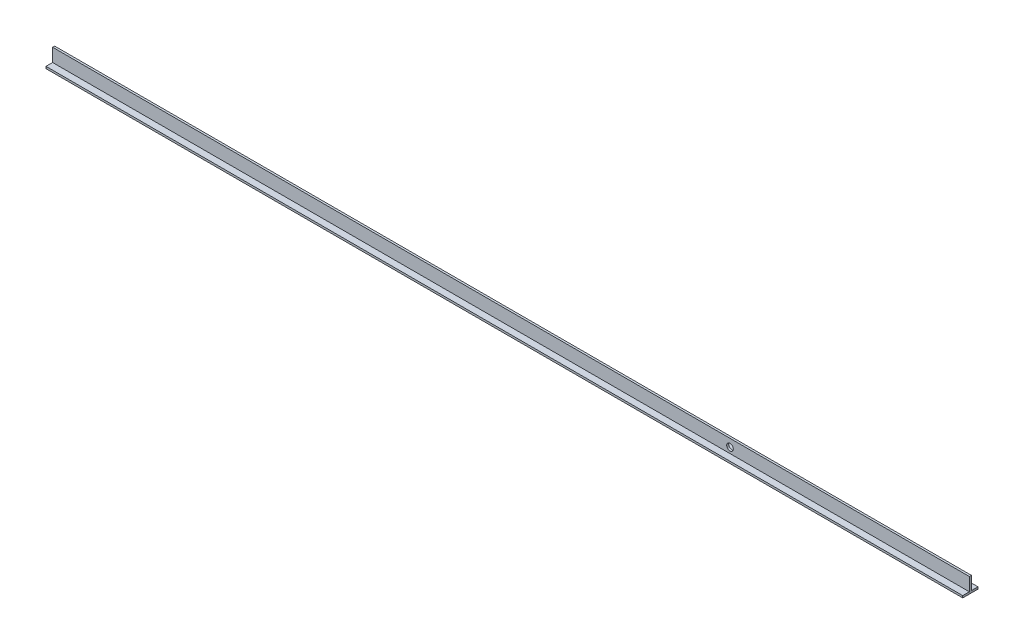
ISO-10303-21;
HEADER;
FILE_DESCRIPTION(('STEP AP214'),'2;1');
FILE_NAME('part.step','',(''),(''),'','','');
FILE_SCHEMA(('AUTOMOTIVE_DESIGN { 1 0 10303 214 1 1 1 1 }'));
ENDSEC;
DATA;
#1=APPLICATION_CONTEXT('core data for automotive mechanical design processes');
#2=APPLICATION_PROTOCOL_DEFINITION('international standard','automotive_design',2000,#1);
#3=PRODUCT_CONTEXT('',#1,'mechanical');
#4=PRODUCT('Part','Part','',(#3));
#5=PRODUCT_RELATED_PRODUCT_CATEGORY('part','',(#4));
#6=PRODUCT_DEFINITION_FORMATION('','',#4);
#7=PRODUCT_DEFINITION_CONTEXT('part definition',#1,'design');
#8=PRODUCT_DEFINITION('design','',#6,#7);
#9=PRODUCT_DEFINITION_SHAPE('','',#8);
#10=(LENGTH_UNIT() NAMED_UNIT(*) SI_UNIT(.MILLI.,.METRE.));
#11=(NAMED_UNIT(*) PLANE_ANGLE_UNIT() SI_UNIT($,.RADIAN.));
#12=(NAMED_UNIT(*) SI_UNIT($,.STERADIAN.) SOLID_ANGLE_UNIT());
#13=UNCERTAINTY_MEASURE_WITH_UNIT(LENGTH_MEASURE(1.E-05),#10,'distance_accuracy_value','');
#14=(GEOMETRIC_REPRESENTATION_CONTEXT(3) GLOBAL_UNCERTAINTY_ASSIGNED_CONTEXT((#13)) GLOBAL_UNIT_ASSIGNED_CONTEXT((#10,
#11,#12)) REPRESENTATION_CONTEXT('',''));
#15=CARTESIAN_POINT('',(0.,0.,0.));
#16=DIRECTION('',(0.,0.,1.));
#17=DIRECTION('',(1.,0.,0.));
#18=AXIS2_PLACEMENT_3D('',#15,#16,#17);
#19=CARTESIAN_POINT('',(-900.,3.99999999999984,15.));
#20=DIRECTION('',(0.,0.,-1.));
#21=DIRECTION('',(0.,1.,0.));
#22=AXIS2_PLACEMENT_3D('',#19,#20,#21);
#23=PLANE('',#22);
#24=DIRECTION('',(0.,1.,0.));
#25=VECTOR('',#24,1.);
#26=CARTESIAN_POINT('',(900.,4.00000000000039,15.));
#27=LINE('',#26,#25);
#28=CARTESIAN_POINT('',(900.,3.91599383446464E-13,15.));
#29=VERTEX_POINT('',#28);
#30=CARTESIAN_POINT('',(900.,4.00000000000039,15.));
#31=VERTEX_POINT('',#30);
#32=EDGE_CURVE('E163',#29,#31,#27,.T.);
#33=ORIENTED_EDGE('',*,*,#32,.T.);
#34=DIRECTION('',(1.,0.,0.));
#35=VECTOR('',#34,1.);
#36=CARTESIAN_POINT('',(-900.,3.99999999999984,15.));
#37=LINE('',#36,#35);
#38=CARTESIAN_POINT('',(-900.,3.99999999999984,15.));
#39=VERTEX_POINT('',#38);
#40=EDGE_CURVE('E13',#39,#31,#37,.T.);
#41=ORIENTED_EDGE('',*,*,#40,.F.);
#42=DIRECTION('',(0.,1.,0.));
#43=VECTOR('',#42,1.);
#44=CARTESIAN_POINT('',(-900.,3.99999999999984,15.));
#45=LINE('',#44,#43);
#46=CARTESIAN_POINT('',(-900.,-1.59491676169845E-13,15.));
#47=VERTEX_POINT('',#46);
#48=EDGE_CURVE('E178',#47,#39,#45,.T.);
#49=ORIENTED_EDGE('',*,*,#48,.F.);
#50=DIRECTION('',(1.,0.,0.));
#51=VECTOR('',#50,1.);
#52=CARTESIAN_POINT('',(-900.,-1.59491676169845E-13,15.));
#53=LINE('',#52,#51);
#54=EDGE_CURVE('E159',#47,#29,#53,.T.);
#55=ORIENTED_EDGE('',*,*,#54,.T.);
#56=EDGE_LOOP('',(#33,#41,#49,#55));
#57=FACE_BOUND('',#56,.T.);
#58=ADVANCED_FACE('F66',(#57),#23,.F.);
#59=CARTESIAN_POINT('',(-900.,3.99999999999979,1.99999999999999));
#60=DIRECTION('',(0.,-1.,0.));
#61=DIRECTION('',(0.,0.,-1.));
#62=AXIS2_PLACEMENT_3D('',#59,#60,#61);
#63=PLANE('',#62);
#64=DIRECTION('',(0.,0.,-1.));
#65=VECTOR('',#64,1.);
#66=CARTESIAN_POINT('',(900.,4.00000000000034,1.99999999999999));
#67=LINE('',#66,#65);
#68=CARTESIAN_POINT('',(900.,4.00000000000034,1.99999999999999));
#69=VERTEX_POINT('',#68);
#70=EDGE_CURVE('E166',#31,#69,#67,.T.);
#71=ORIENTED_EDGE('',*,*,#70,.T.);
#72=DIRECTION('',(1.,0.,0.));
#73=VECTOR('',#72,1.);
#74=CARTESIAN_POINT('',(-900.,3.99999999999979,1.99999999999999));
#75=LINE('',#74,#73);
#76=CARTESIAN_POINT('',(-900.,3.99999999999979,1.99999999999999));
#77=VERTEX_POINT('',#76);
#78=EDGE_CURVE('E75',#77,#69,#75,.T.);
#79=ORIENTED_EDGE('',*,*,#78,.F.);
#80=DIRECTION('',(0.,0.,-1.));
#81=VECTOR('',#80,1.);
#82=CARTESIAN_POINT('',(-900.,3.99999999999979,1.99999999999999));
#83=LINE('',#82,#81);
#84=EDGE_CURVE('E126',#39,#77,#83,.T.);
#85=ORIENTED_EDGE('',*,*,#84,.F.);
#86=ORIENTED_EDGE('',*,*,#40,.T.);
#87=EDGE_LOOP('',(#71,#79,#85,#86));
#88=FACE_BOUND('',#87,.T.);
#89=ADVANCED_FACE('F229',(#88),#63,.F.);
#90=CARTESIAN_POINT('',(-900.,29.9999999999998,1.99999999999989));
#91=DIRECTION('',(0.,0.,-1.));
#92=DIRECTION('',(0.,1.,0.));
#93=AXIS2_PLACEMENT_3D('',#90,#91,#92);
#94=PLANE('',#93);
#95=CARTESIAN_POINT('',(430.,14.9999999999996,1.99999999999995));
#96=DIRECTION('',(0.,0.,-1.));
#97=DIRECTION('',(0.,1.,0.));
#98=AXIS2_PLACEMENT_3D('',#95,#96,#97);
#99=CIRCLE('',#98,6.49999999999997);
#100=CARTESIAN_POINT('',(430.,21.4999999999996,1.99999999999993));
#101=VERTEX_POINT('',#100);
#102=EDGE_CURVE('E167',#101,#101,#99,.T.);
#103=ORIENTED_EDGE('',*,*,#102,.T.);
#104=EDGE_LOOP('',(#103));
#105=FACE_BOUND('',#104,.T.);
#106=DIRECTION('',(0.,1.,0.));
#107=VECTOR('',#106,1.);
#108=CARTESIAN_POINT('',(900.,30.0000000000003,1.99999999999989));
#109=LINE('',#108,#107);
#110=CARTESIAN_POINT('',(900.,30.0000000000003,1.99999999999989));
#111=VERTEX_POINT('',#110);
#112=EDGE_CURVE('E169',#69,#111,#109,.T.);
#113=ORIENTED_EDGE('',*,*,#112,.T.);
#114=DIRECTION('',(1.,0.,0.));
#115=VECTOR('',#114,1.);
#116=CARTESIAN_POINT('',(-900.,29.9999999999998,1.99999999999989));
#117=LINE('',#116,#115);
#118=CARTESIAN_POINT('',(-900.,29.9999999999998,1.99999999999989));
#119=VERTEX_POINT('',#118);
#120=EDGE_CURVE('E185',#119,#111,#117,.T.);
#121=ORIENTED_EDGE('',*,*,#120,.F.);
#122=DIRECTION('',(0.,1.,0.));
#123=VECTOR('',#122,1.);
#124=CARTESIAN_POINT('',(-900.,29.9999999999998,1.99999999999989));
#125=LINE('',#124,#123);
#126=EDGE_CURVE('E194',#77,#119,#125,.T.);
#127=ORIENTED_EDGE('',*,*,#126,.F.);
#128=ORIENTED_EDGE('',*,*,#78,.T.);
#129=EDGE_LOOP('',(#113,#121,#127,#128));
#130=FACE_BOUND('',#129,.T.);
#131=ADVANCED_FACE('F192',(#105,#130),#94,.F.);
#132=CARTESIAN_POINT('',(-900.,29.9999999999998,-2.0000000000001));
#133=DIRECTION('',(0.,-1.,0.));
#134=DIRECTION('',(0.,0.,-1.));
#135=AXIS2_PLACEMENT_3D('',#132,#133,#134);
#136=PLANE('',#135);
#137=DIRECTION('',(0.,0.,-1.));
#138=VECTOR('',#137,1.);
#139=CARTESIAN_POINT('',(900.,30.0000000000003,-2.0000000000001));
#140=LINE('',#139,#138);
#141=CARTESIAN_POINT('',(900.,30.0000000000003,-2.0000000000001));
#142=VERTEX_POINT('',#141);
#143=EDGE_CURVE('E171',#111,#142,#140,.T.);
#144=ORIENTED_EDGE('',*,*,#143,.T.);
#145=DIRECTION('',(1.,0.,0.));
#146=VECTOR('',#145,1.);
#147=CARTESIAN_POINT('',(-900.,29.9999999999998,-2.0000000000001));
#148=LINE('',#147,#146);
#149=CARTESIAN_POINT('',(-900.,29.9999999999998,-2.0000000000001));
#150=VERTEX_POINT('',#149);
#151=EDGE_CURVE('E182',#150,#142,#148,.T.);
#152=ORIENTED_EDGE('',*,*,#151,.F.);
#153=DIRECTION('',(0.,0.,-1.));
#154=VECTOR('',#153,1.);
#155=CARTESIAN_POINT('',(-900.,29.9999999999998,-2.0000000000001));
#156=LINE('',#155,#154);
#157=EDGE_CURVE('E206',#119,#150,#156,.T.);
#158=ORIENTED_EDGE('',*,*,#157,.F.);
#159=ORIENTED_EDGE('',*,*,#120,.T.);
#160=EDGE_LOOP('',(#144,#152,#158,#159));
#161=FACE_BOUND('',#160,.T.);
#162=ADVANCED_FACE('F202',(#161),#136,.F.);
#163=CARTESIAN_POINT('',(-900.,3.99999999999978,-2.00000000000002));
#164=DIRECTION('',(0.,0.,1.));
#165=DIRECTION('',(0.,-1.,0.));
#166=AXIS2_PLACEMENT_3D('',#163,#164,#165);
#167=PLANE('',#166);
#168=CARTESIAN_POINT('',(430.,14.9999999999996,-2.00000000000005));
#169=DIRECTION('',(0.,0.,1.));
#170=DIRECTION('',(0.,-1.,0.));
#171=AXIS2_PLACEMENT_3D('',#168,#169,#170);
#172=CIRCLE('',#171,6.49999999999997);
#173=CARTESIAN_POINT('',(430.,8.49999999999963,-2.00000000000003));
#174=VERTEX_POINT('',#173);
#175=EDGE_CURVE('E69',#174,#174,#172,.T.);
#176=ORIENTED_EDGE('',*,*,#175,.T.);
#177=EDGE_LOOP('',(#176));
#178=FACE_BOUND('',#177,.T.);
#179=DIRECTION('',(0.,-1.,0.));
#180=VECTOR('',#179,1.);
#181=CARTESIAN_POINT('',(900.,4.00000000000033,-2.00000000000002));
#182=LINE('',#181,#180);
#183=CARTESIAN_POINT('',(900.,4.00000000000033,-2.00000000000002));
#184=VERTEX_POINT('',#183);
#185=EDGE_CURVE('E173',#142,#184,#182,.T.);
#186=ORIENTED_EDGE('',*,*,#185,.T.);
#187=DIRECTION('',(1.,0.,0.));
#188=VECTOR('',#187,1.);
#189=CARTESIAN_POINT('',(-900.,3.99999999999978,-2.00000000000002));
#190=LINE('',#189,#188);
#191=CARTESIAN_POINT('',(-900.,3.99999999999978,-2.00000000000002));
#192=VERTEX_POINT('',#191);
#193=EDGE_CURVE('E154',#192,#184,#190,.T.);
#194=ORIENTED_EDGE('',*,*,#193,.F.);
#195=DIRECTION('',(0.,-1.,0.));
#196=VECTOR('',#195,1.);
#197=CARTESIAN_POINT('',(-900.,3.99999999999978,-2.00000000000002));
#198=LINE('',#197,#196);
#199=EDGE_CURVE('E145',#150,#192,#198,.T.);
#200=ORIENTED_EDGE('',*,*,#199,.F.);
#201=ORIENTED_EDGE('',*,*,#151,.T.);
#202=EDGE_LOOP('',(#186,#194,#200,#201));
#203=FACE_BOUND('',#202,.T.);
#204=ADVANCED_FACE('F205',(#178,#203),#167,.F.);
#205=CARTESIAN_POINT('',(-900.,3.99999999999973,-15.));
#206=DIRECTION('',(0.,-1.,0.));
#207=DIRECTION('',(0.,0.,-1.));
#208=AXIS2_PLACEMENT_3D('',#205,#206,#207);
#209=PLANE('',#208);
#210=DIRECTION('',(0.,0.,-1.));
#211=VECTOR('',#210,1.);
#212=CARTESIAN_POINT('',(900.,4.00000000000028,-15.));
#213=LINE('',#212,#211);
#214=CARTESIAN_POINT('',(900.,4.00000000000028,-15.));
#215=VERTEX_POINT('',#214);
#216=EDGE_CURVE('E153',#184,#215,#213,.T.);
#217=ORIENTED_EDGE('',*,*,#216,.T.);
#218=DIRECTION('',(1.,0.,0.));
#219=VECTOR('',#218,1.);
#220=CARTESIAN_POINT('',(-900.,3.99999999999973,-15.));
#221=LINE('',#220,#219);
#222=CARTESIAN_POINT('',(-900.,3.99999999999973,-15.));
#223=VERTEX_POINT('',#222);
#224=EDGE_CURVE('E150',#223,#215,#221,.T.);
#225=ORIENTED_EDGE('',*,*,#224,.F.);
#226=DIRECTION('',(0.,0.,-1.));
#227=VECTOR('',#226,1.);
#228=CARTESIAN_POINT('',(-900.,3.99999999999973,-15.));
#229=LINE('',#228,#227);
#230=EDGE_CURVE('E139',#192,#223,#229,.T.);
#231=ORIENTED_EDGE('',*,*,#230,.F.);
#232=ORIENTED_EDGE('',*,*,#193,.T.);
#233=EDGE_LOOP('',(#217,#225,#231,#232));
#234=FACE_BOUND('',#233,.T.);
#235=ADVANCED_FACE('F151',(#234),#209,.F.);
#236=CARTESIAN_POINT('',(-900.,-2.69747026931302E-13,-15.));
#237=DIRECTION('',(0.,0.,1.));
#238=DIRECTION('',(0.,-1.,0.));
#239=AXIS2_PLACEMENT_3D('',#236,#237,#238);
#240=PLANE('',#239);
#241=DIRECTION('',(0.,-1.,0.));
#242=VECTOR('',#241,1.);
#243=CARTESIAN_POINT('',(900.,2.81344032685007E-13,-15.));
#244=LINE('',#243,#242);
#245=CARTESIAN_POINT('',(900.,2.81344032685007E-13,-15.));
#246=VERTEX_POINT('',#245);
#247=EDGE_CURVE('E112',#215,#246,#244,.T.);
#248=ORIENTED_EDGE('',*,*,#247,.T.);
#249=DIRECTION('',(1.,0.,0.));
#250=VECTOR('',#249,1.);
#251=CARTESIAN_POINT('',(-900.,-2.69747026931302E-13,-15.));
#252=LINE('',#251,#250);
#253=CARTESIAN_POINT('',(-900.,-2.69747026931302E-13,-15.));
#254=VERTEX_POINT('',#253);
#255=EDGE_CURVE('E155',#254,#246,#252,.T.);
#256=ORIENTED_EDGE('',*,*,#255,.F.);
#257=DIRECTION('',(0.,-1.,0.));
#258=VECTOR('',#257,1.);
#259=CARTESIAN_POINT('',(-900.,-2.69747026931302E-13,-15.));
#260=LINE('',#259,#258);
#261=EDGE_CURVE('E143',#223,#254,#260,.T.);
#262=ORIENTED_EDGE('',*,*,#261,.F.);
#263=ORIENTED_EDGE('',*,*,#224,.T.);
#264=EDGE_LOOP('',(#248,#256,#262,#263));
#265=FACE_BOUND('',#264,.T.);
#266=ADVANCED_FACE('F157',(#265),#240,.F.);
#267=CARTESIAN_POINT('',(-900.,-2.69747026931302E-13,-15.));
#268=DIRECTION('',(0.,1.,0.));
#269=DIRECTION('',(0.,0.,1.));
#270=AXIS2_PLACEMENT_3D('',#267,#268,#269);
#271=PLANE('',#270);
#272=DIRECTION('',(0.,0.,1.));
#273=VECTOR('',#272,1.);
#274=CARTESIAN_POINT('',(900.,2.81344032685007E-13,-15.));
#275=LINE('',#274,#273);
#276=EDGE_CURVE('E118',#246,#29,#275,.T.);
#277=ORIENTED_EDGE('',*,*,#276,.T.);
#278=ORIENTED_EDGE('',*,*,#54,.F.);
#279=DIRECTION('',(0.,0.,1.));
#280=VECTOR('',#279,1.);
#281=CARTESIAN_POINT('',(-900.,-2.69747026931302E-13,-15.));
#282=LINE('',#281,#280);
#283=EDGE_CURVE('E83',#254,#47,#282,.T.);
#284=ORIENTED_EDGE('',*,*,#283,.F.);
#285=ORIENTED_EDGE('',*,*,#255,.T.);
#286=EDGE_LOOP('',(#277,#278,#284,#285));
#287=FACE_BOUND('',#286,.T.);
#288=ADVANCED_FACE('F236',(#287),#271,.F.);
#289=CARTESIAN_POINT('',(-900.,-5.51091059616309E-13,0.));
#290=DIRECTION('',(-1.,0.,0.));
#291=DIRECTION('',(0.,0.,1.));
#292=AXIS2_PLACEMENT_3D('',#289,#290,#291);
#293=PLANE('',#292);
#294=ORIENTED_EDGE('',*,*,#48,.T.);
#295=ORIENTED_EDGE('',*,*,#84,.T.);
#296=ORIENTED_EDGE('',*,*,#126,.T.);
#297=ORIENTED_EDGE('',*,*,#157,.T.);
#298=ORIENTED_EDGE('',*,*,#199,.T.);
#299=ORIENTED_EDGE('',*,*,#230,.T.);
#300=ORIENTED_EDGE('',*,*,#261,.T.);
#301=ORIENTED_EDGE('',*,*,#283,.T.);
#302=EDGE_LOOP('',(#294,#295,#296,#297,#298,#299,#300,#301));
#303=FACE_BOUND('',#302,.T.);
#304=ADVANCED_FACE('F141',(#303),#293,.T.);
#305=CARTESIAN_POINT('',(900.,0.,0.));
#306=DIRECTION('',(-1.,0.,0.));
#307=DIRECTION('',(0.,0.,1.));
#308=AXIS2_PLACEMENT_3D('',#305,#306,#307);
#309=PLANE('',#308);
#310=ORIENTED_EDGE('',*,*,#32,.F.);
#311=ORIENTED_EDGE('',*,*,#276,.F.);
#312=ORIENTED_EDGE('',*,*,#247,.F.);
#313=ORIENTED_EDGE('',*,*,#216,.F.);
#314=ORIENTED_EDGE('',*,*,#185,.F.);
#315=ORIENTED_EDGE('',*,*,#143,.F.);
#316=ORIENTED_EDGE('',*,*,#112,.F.);
#317=ORIENTED_EDGE('',*,*,#70,.F.);
#318=EDGE_LOOP('',(#310,#311,#312,#313,#314,#315,#316,#317));
#319=FACE_BOUND('',#318,.T.);
#320=ADVANCED_FACE('F198',(#319),#309,.F.);
#321=CARTESIAN_POINT('',(430.,14.9999999999996,-15.));
#322=DIRECTION('',(0.,0.,1.));
#323=DIRECTION('',(1.,0.,0.));
#324=AXIS2_PLACEMENT_3D('',#321,#322,#323);
#325=CYLINDRICAL_SURFACE('',#324,6.49999999999997);
#326=ORIENTED_EDGE('',*,*,#175,.F.);
#327=EDGE_LOOP('',(#326));
#328=FACE_BOUND('',#327,.T.);
#329=ORIENTED_EDGE('',*,*,#102,.F.);
#330=EDGE_LOOP('',(#329));
#331=FACE_BOUND('',#330,.T.);
#332=ADVANCED_FACE('F219',(#328,#331),#325,.F.);
#333=CLOSED_SHELL('',(#58,#89,#131,#162,#204,#235,#266,#288,#304,#320,#332));
#334=MANIFOLD_SOLID_BREP('B2',#333);
#335=ADVANCED_BREP_SHAPE_REPRESENTATION('',(#18,#334),#14);
#336=SHAPE_DEFINITION_REPRESENTATION(#9,#335);
ENDSEC;
END-ISO-10303-21;
